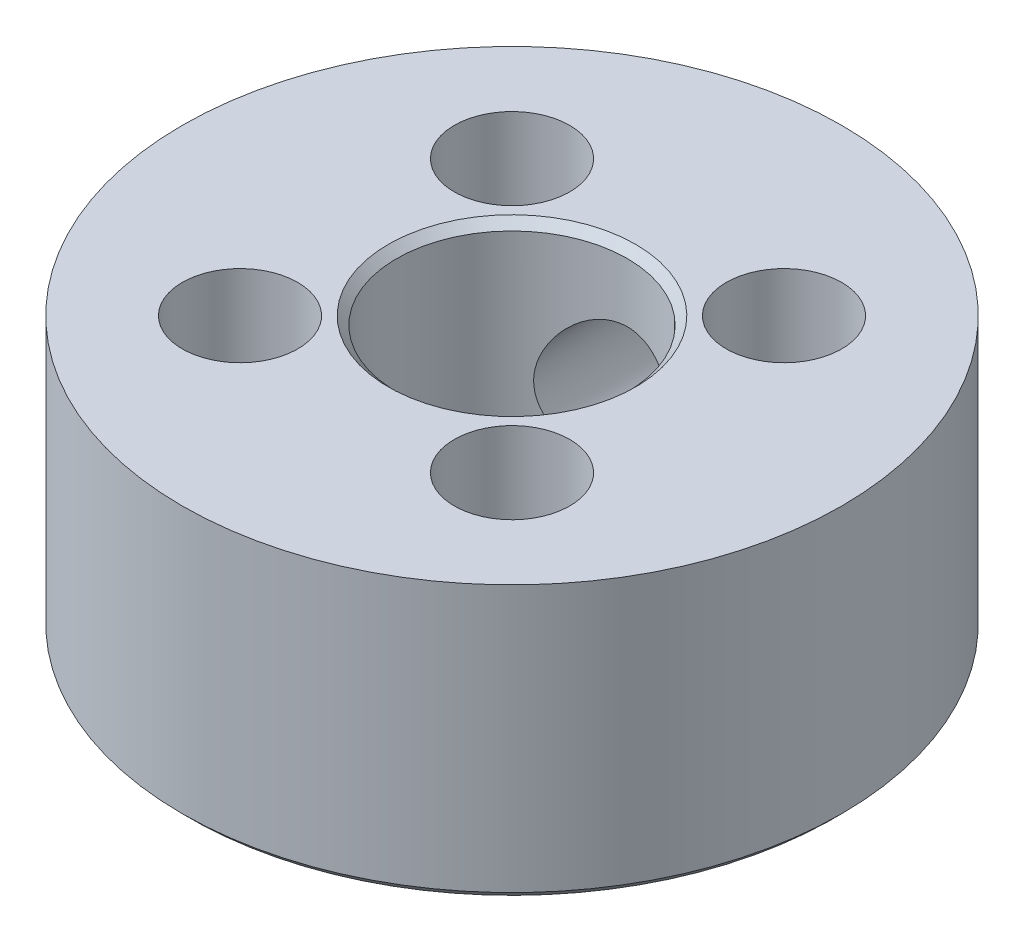
ISO-10303-21;
HEADER;
FILE_DESCRIPTION(('STEP AP214'),'2;1');
FILE_NAME('part.step','',(''),(''),'','','');
FILE_SCHEMA(('AUTOMOTIVE_DESIGN { 1 0 10303 214 1 1 1 1 }'));
ENDSEC;
DATA;
#1=APPLICATION_CONTEXT('core data for automotive mechanical design processes');
#2=APPLICATION_PROTOCOL_DEFINITION('international standard','automotive_design',2000,#1);
#3=PRODUCT_CONTEXT('',#1,'mechanical');
#4=PRODUCT('Part','Part','',(#3));
#5=PRODUCT_RELATED_PRODUCT_CATEGORY('part','',(#4));
#6=PRODUCT_DEFINITION_FORMATION('','',#4);
#7=PRODUCT_DEFINITION_CONTEXT('part definition',#1,'design');
#8=PRODUCT_DEFINITION('design','',#6,#7);
#9=PRODUCT_DEFINITION_SHAPE('','',#8);
#10=(LENGTH_UNIT() NAMED_UNIT(*) SI_UNIT(.MILLI.,.METRE.));
#11=(NAMED_UNIT(*) PLANE_ANGLE_UNIT() SI_UNIT($,.RADIAN.));
#12=(NAMED_UNIT(*) SI_UNIT($,.STERADIAN.) SOLID_ANGLE_UNIT());
#13=UNCERTAINTY_MEASURE_WITH_UNIT(LENGTH_MEASURE(1.E-05),#10,'distance_accuracy_value','');
#14=(GEOMETRIC_REPRESENTATION_CONTEXT(3) GLOBAL_UNCERTAINTY_ASSIGNED_CONTEXT((#13)) GLOBAL_UNIT_ASSIGNED_CONTEXT((#10,
#11,#12)) REPRESENTATION_CONTEXT('',''));
#15=CARTESIAN_POINT('',(0.,0.,0.));
#16=DIRECTION('',(0.,0.,1.));
#17=DIRECTION('',(1.,0.,0.));
#18=AXIS2_PLACEMENT_3D('',#15,#16,#17);
#19=CARTESIAN_POINT('',(-30.4497461438242,18.50200000001,4.94974614382413));
#20=DIRECTION('',(0.,1.,0.));
#21=DIRECTION('',(0.,0.,-1.));
#22=AXIS2_PLACEMENT_3D('',#19,#20,#21);
#23=CYLINDRICAL_SURFACE('',#22,1.25);
#24=CARTESIAN_POINT('',(-30.4497461438242,10.50000000001,4.94974614382413));
#25=DIRECTION('',(0.,-1.,0.));
#26=DIRECTION('',(0.,0.,-1.));
#27=AXIS2_PLACEMENT_3D('',#24,#25,#26);
#28=CIRCLE('',#27,1.25);
#29=CARTESIAN_POINT('',(-30.4497461438242,10.50000000001,3.69974614382413));
#30=VERTEX_POINT('',#29);
#31=EDGE_CURVE('E37',#30,#30,#28,.F.);
#32=ORIENTED_EDGE('',*,*,#31,.T.);
#33=EDGE_LOOP('',(#32));
#34=FACE_BOUND('',#33,.T.);
#35=CARTESIAN_POINT('',(-30.4497461438242,8.80000000000791,4.94974614382413));
#36=DIRECTION('',(0.,1.,0.));
#37=DIRECTION('',(0.,0.,1.));
#38=AXIS2_PLACEMENT_3D('',#35,#36,#37);
#39=CIRCLE('',#38,1.24999999998268);
#40=CARTESIAN_POINT('',(-30.4497461438242,8.80000000000896,3.69974614383279));
#41=VERTEX_POINT('',#40);
#42=EDGE_CURVE('E163',#41,#41,#39,.T.);
#43=ORIENTED_EDGE('',*,*,#42,.F.);
#44=EDGE_LOOP('',(#43));
#45=FACE_BOUND('',#44,.T.);
#46=ADVANCED_FACE('F34',(#34,#45),#23,.F.);
#47=CARTESIAN_POINT('',(-20.5502538561759,18.50200000001,4.94974614382412));
#48=DIRECTION('',(0.,1.,0.));
#49=DIRECTION('',(0.,0.,-1.));
#50=AXIS2_PLACEMENT_3D('',#47,#48,#49);
#51=CYLINDRICAL_SURFACE('',#50,1.25);
#52=CARTESIAN_POINT('',(-20.5502538561759,10.50000000001,4.94974614382412));
#53=DIRECTION('',(0.,-1.,0.));
#54=DIRECTION('',(0.,0.,-1.));
#55=AXIS2_PLACEMENT_3D('',#52,#53,#54);
#56=CIRCLE('',#55,1.25);
#57=CARTESIAN_POINT('',(-20.5502538561759,10.50000000001,3.69974614382412));
#58=VERTEX_POINT('',#57);
#59=EDGE_CURVE('E121',#58,#58,#56,.F.);
#60=ORIENTED_EDGE('',*,*,#59,.T.);
#61=EDGE_LOOP('',(#60));
#62=FACE_BOUND('',#61,.T.);
#63=CARTESIAN_POINT('',(-20.5502538561759,8.80000000000791,4.94974614382412));
#64=DIRECTION('',(0.,1.,0.));
#65=DIRECTION('',(0.,0.,1.));
#66=AXIS2_PLACEMENT_3D('',#63,#64,#65);
#67=CIRCLE('',#66,1.24999999998269);
#68=CARTESIAN_POINT('',(-20.5502538561759,8.80000000000896,3.69974614383278));
#69=VERTEX_POINT('',#68);
#70=EDGE_CURVE('E130',#69,#69,#67,.T.);
#71=ORIENTED_EDGE('',*,*,#70,.F.);
#72=EDGE_LOOP('',(#71));
#73=FACE_BOUND('',#72,.T.);
#74=ADVANCED_FACE('F265',(#62,#73),#51,.F.);
#75=CARTESIAN_POINT('',(-20.5502538561759,18.50200000001,-4.94974614382412));
#76=DIRECTION('',(0.,1.,0.));
#77=DIRECTION('',(0.,0.,-1.));
#78=AXIS2_PLACEMENT_3D('',#75,#76,#77);
#79=CYLINDRICAL_SURFACE('',#78,1.25);
#80=CARTESIAN_POINT('',(-20.5502538561759,10.50000000001,-4.94974614382412));
#81=DIRECTION('',(0.,-1.,0.));
#82=DIRECTION('',(0.,0.,-1.));
#83=AXIS2_PLACEMENT_3D('',#80,#81,#82);
#84=CIRCLE('',#83,1.25);
#85=CARTESIAN_POINT('',(-20.5502538561759,10.50000000001,-6.19974614382412));
#86=VERTEX_POINT('',#85);
#87=EDGE_CURVE('E292',#86,#86,#84,.F.);
#88=ORIENTED_EDGE('',*,*,#87,.T.);
#89=EDGE_LOOP('',(#88));
#90=FACE_BOUND('',#89,.T.);
#91=CARTESIAN_POINT('',(-20.5502538561759,8.80000000006476,-4.94974614382412));
#92=DIRECTION('',(0.,1.,0.));
#93=DIRECTION('',(0.,0.,1.));
#94=AXIS2_PLACEMENT_3D('',#91,#92,#93);
#95=CIRCLE('',#94,1.2499999999582);
#96=CARTESIAN_POINT('',(-20.5502538561759,8.80000000003738,-6.19974614380322));
#97=VERTEX_POINT('',#96);
#98=EDGE_CURVE('E50',#97,#97,#95,.T.);
#99=ORIENTED_EDGE('',*,*,#98,.F.);
#100=EDGE_LOOP('',(#99));
#101=FACE_BOUND('',#100,.T.);
#102=ADVANCED_FACE('F262',(#90,#101),#79,.F.);
#103=CARTESIAN_POINT('',(-30.4497461438242,18.50200000001,-4.94974614382412));
#104=DIRECTION('',(0.,1.,0.));
#105=DIRECTION('',(0.,0.,-1.));
#106=AXIS2_PLACEMENT_3D('',#103,#104,#105);
#107=CYLINDRICAL_SURFACE('',#106,1.25);
#108=CARTESIAN_POINT('',(-30.4497461438242,10.50000000001,-4.94974614382412));
#109=DIRECTION('',(0.,-1.,0.));
#110=DIRECTION('',(0.,0.,-1.));
#111=AXIS2_PLACEMENT_3D('',#108,#109,#110);
#112=CIRCLE('',#111,1.25);
#113=CARTESIAN_POINT('',(-30.4497461438242,10.50000000001,-6.19974614382412));
#114=VERTEX_POINT('',#113);
#115=EDGE_CURVE('E290',#114,#114,#112,.F.);
#116=ORIENTED_EDGE('',*,*,#115,.T.);
#117=EDGE_LOOP('',(#116));
#118=FACE_BOUND('',#117,.T.);
#119=CARTESIAN_POINT('',(-30.4497461438242,8.80000000006476,-4.94974614382412));
#120=DIRECTION('',(0.,1.,0.));
#121=DIRECTION('',(0.,0.,1.));
#122=AXIS2_PLACEMENT_3D('',#119,#120,#121);
#123=CIRCLE('',#122,1.2499999999582);
#124=CARTESIAN_POINT('',(-30.4497461438242,8.80000000003738,-6.19974614380322));
#125=VERTEX_POINT('',#124);
#126=EDGE_CURVE('E167',#125,#125,#123,.T.);
#127=ORIENTED_EDGE('',*,*,#126,.F.);
#128=EDGE_LOOP('',(#127));
#129=FACE_BOUND('',#128,.T.);
#130=ADVANCED_FACE('F259',(#118,#129),#107,.F.);
#131=CARTESIAN_POINT('',(-20.5502538561759,8.49999999996953,-4.94974614382412));
#132=DIRECTION('',(0.,-1.,0.));
#133=DIRECTION('',(0.,0.,1.));
#134=AXIS2_PLACEMENT_3D('',#131,#132,#133);
#135=CONICAL_SURFACE('',#134,1.54999999999658,0.785398163302709);
#136=ORIENTED_EDGE('',*,*,#98,.T.);
#137=EDGE_LOOP('',(#136));
#138=FACE_BOUND('',#137,.T.);
#139=CARTESIAN_POINT('',(-20.5502538561759,8.49999999996953,-4.94974614382412));
#140=DIRECTION('',(0.,1.,0.));
#141=DIRECTION('',(0.,0.,1.));
#142=AXIS2_PLACEMENT_3D('',#139,#140,#141);
#143=CIRCLE('',#142,1.54999999999658);
#144=CARTESIAN_POINT('',(-20.5502538561759,8.49999999996953,-6.4997461438207));
#145=VERTEX_POINT('',#144);
#146=EDGE_CURVE('E285',#145,#145,#143,.T.);
#147=ORIENTED_EDGE('',*,*,#146,.F.);
#148=EDGE_LOOP('',(#147));
#149=FACE_BOUND('',#148,.T.);
#150=ADVANCED_FACE('F255',(#138,#149),#135,.F.);
#151=CARTESIAN_POINT('',(-30.4497461438242,8.49999999996953,-4.94974614382412));
#152=DIRECTION('',(0.,-1.,0.));
#153=DIRECTION('',(0.,0.,1.));
#154=AXIS2_PLACEMENT_3D('',#151,#152,#153);
#155=CONICAL_SURFACE('',#154,1.54999999999658,0.785398163302709);
#156=ORIENTED_EDGE('',*,*,#126,.T.);
#157=EDGE_LOOP('',(#156));
#158=FACE_BOUND('',#157,.T.);
#159=CARTESIAN_POINT('',(-30.4497461438242,8.49999999996953,-4.94974614382412));
#160=DIRECTION('',(0.,1.,0.));
#161=DIRECTION('',(0.,0.,1.));
#162=AXIS2_PLACEMENT_3D('',#159,#160,#161);
#163=CIRCLE('',#162,1.54999999999658);
#164=CARTESIAN_POINT('',(-30.4497461438242,8.49999999996953,-6.4997461438207));
#165=VERTEX_POINT('',#164);
#166=EDGE_CURVE('E281',#165,#165,#163,.T.);
#167=ORIENTED_EDGE('',*,*,#166,.F.);
#168=EDGE_LOOP('',(#167));
#169=FACE_BOUND('',#168,.T.);
#170=ADVANCED_FACE('F251',(#158,#169),#155,.F.);
#171=CARTESIAN_POINT('',(-30.4497461438242,8.50000000002638,4.94974614382413));
#172=DIRECTION('',(0.,-1.,0.));
#173=DIRECTION('',(0.,0.,1.));
#174=AXIS2_PLACEMENT_3D('',#171,#172,#173);
#175=CONICAL_SURFACE('',#174,1.54999999996421,0.785398163397448);
#176=ORIENTED_EDGE('',*,*,#42,.T.);
#177=EDGE_LOOP('',(#176));
#178=FACE_BOUND('',#177,.T.);
#179=CARTESIAN_POINT('',(-30.4497461438242,8.50000000002638,4.94974614382413));
#180=DIRECTION('',(0.,1.,0.));
#181=DIRECTION('',(0.,0.,1.));
#182=AXIS2_PLACEMENT_3D('',#179,#180,#181);
#183=CIRCLE('',#182,1.54999999996421);
#184=CARTESIAN_POINT('',(-30.4497461438242,8.50000000002638,3.39974614385992));
#185=VERTEX_POINT('',#184);
#186=EDGE_CURVE('E278',#185,#185,#183,.T.);
#187=ORIENTED_EDGE('',*,*,#186,.F.);
#188=EDGE_LOOP('',(#187));
#189=FACE_BOUND('',#188,.T.);
#190=ADVANCED_FACE('F248',(#178,#189),#175,.F.);
#191=CARTESIAN_POINT('',(-20.5502538561759,8.50000000002638,4.94974614382412));
#192=DIRECTION('',(0.,-1.,0.));
#193=DIRECTION('',(0.,0.,1.));
#194=AXIS2_PLACEMENT_3D('',#191,#192,#193);
#195=CONICAL_SURFACE('',#194,1.54999999996422,0.785398163397448);
#196=ORIENTED_EDGE('',*,*,#70,.T.);
#197=EDGE_LOOP('',(#196));
#198=FACE_BOUND('',#197,.T.);
#199=CARTESIAN_POINT('',(-20.5502538561759,8.50000000002638,4.94974614382412));
#200=DIRECTION('',(0.,1.,0.));
#201=DIRECTION('',(0.,0.,1.));
#202=AXIS2_PLACEMENT_3D('',#199,#200,#201);
#203=CIRCLE('',#202,1.54999999996422);
#204=CARTESIAN_POINT('',(-20.5502538561759,8.50000000002638,3.3997461438599));
#205=VERTEX_POINT('',#204);
#206=EDGE_CURVE('E280',#205,#205,#203,.T.);
#207=ORIENTED_EDGE('',*,*,#206,.F.);
#208=EDGE_LOOP('',(#207));
#209=FACE_BOUND('',#208,.T.);
#210=ADVANCED_FACE('F244',(#198,#209),#195,.F.);
#211=CARTESIAN_POINT('',(-35.50000000002,10.50000000001,0.));
#212=DIRECTION('',(0.,1.,0.));
#213=DIRECTION('',(0.,0.,-1.));
#214=AXIS2_PLACEMENT_3D('',#211,#212,#213);
#215=PLANE('',#214);
#216=ORIENTED_EDGE('',*,*,#31,.F.);
#217=EDGE_LOOP('',(#216));
#218=FACE_BOUND('',#217,.T.);
#219=CARTESIAN_POINT('',(-30.4497461438242,10.50000000001,4.94974614382413));
#220=DIRECTION('',(0.,-1.,0.));
#221=DIRECTION('',(0.,0.,-1.));
#222=AXIS2_PLACEMENT_3D('',#219,#220,#221);
#223=CIRCLE('',#222,2.1);
#224=CARTESIAN_POINT('',(-30.4497461438242,10.50000000001,2.84974614382413));
#225=VERTEX_POINT('',#224);
#226=EDGE_CURVE('E302',#225,#225,#223,.T.);
#227=ORIENTED_EDGE('',*,*,#226,.F.);
#228=EDGE_LOOP('',(#227));
#229=FACE_BOUND('',#228,.T.);
#230=ADVANCED_FACE('F240',(#218,#229),#215,.T.);
#231=CARTESIAN_POINT('',(-35.50000000002,10.50000000001,0.));
#232=DIRECTION('',(0.,1.,0.));
#233=DIRECTION('',(0.,0.,-1.));
#234=AXIS2_PLACEMENT_3D('',#231,#232,#233);
#235=PLANE('',#234);
#236=ORIENTED_EDGE('',*,*,#59,.F.);
#237=EDGE_LOOP('',(#236));
#238=FACE_BOUND('',#237,.T.);
#239=CARTESIAN_POINT('',(-20.5502538561759,10.50000000001,4.94974614382412));
#240=DIRECTION('',(0.,-1.,0.));
#241=DIRECTION('',(0.,0.,-1.));
#242=AXIS2_PLACEMENT_3D('',#239,#240,#241);
#243=CIRCLE('',#242,2.1);
#244=CARTESIAN_POINT('',(-20.5502538561759,10.50000000001,2.84974614382412));
#245=VERTEX_POINT('',#244);
#246=EDGE_CURVE('E299',#245,#245,#243,.T.);
#247=ORIENTED_EDGE('',*,*,#246,.F.);
#248=EDGE_LOOP('',(#247));
#249=FACE_BOUND('',#248,.T.);
#250=ADVANCED_FACE('F236',(#238,#249),#235,.T.);
#251=CARTESIAN_POINT('',(-35.50000000002,10.50000000001,0.));
#252=DIRECTION('',(0.,1.,0.));
#253=DIRECTION('',(0.,0.,-1.));
#254=AXIS2_PLACEMENT_3D('',#251,#252,#253);
#255=PLANE('',#254);
#256=ORIENTED_EDGE('',*,*,#87,.F.);
#257=EDGE_LOOP('',(#256));
#258=FACE_BOUND('',#257,.T.);
#259=CARTESIAN_POINT('',(-20.5502538561759,10.50000000001,-4.94974614382412));
#260=DIRECTION('',(0.,-1.,0.));
#261=DIRECTION('',(0.,0.,-1.));
#262=AXIS2_PLACEMENT_3D('',#259,#260,#261);
#263=CIRCLE('',#262,2.1);
#264=CARTESIAN_POINT('',(-20.5502538561759,10.50000000001,-7.04974614382412));
#265=VERTEX_POINT('',#264);
#266=EDGE_CURVE('E297',#265,#265,#263,.T.);
#267=ORIENTED_EDGE('',*,*,#266,.F.);
#268=EDGE_LOOP('',(#267));
#269=FACE_BOUND('',#268,.T.);
#270=ADVANCED_FACE('F232',(#258,#269),#255,.T.);
#271=CARTESIAN_POINT('',(-35.50000000002,10.50000000001,0.));
#272=DIRECTION('',(0.,1.,0.));
#273=DIRECTION('',(0.,0.,-1.));
#274=AXIS2_PLACEMENT_3D('',#271,#272,#273);
#275=PLANE('',#274);
#276=ORIENTED_EDGE('',*,*,#115,.F.);
#277=EDGE_LOOP('',(#276));
#278=FACE_BOUND('',#277,.T.);
#279=CARTESIAN_POINT('',(-30.4497461438242,10.50000000001,-4.94974614382412));
#280=DIRECTION('',(0.,-1.,0.));
#281=DIRECTION('',(0.,0.,-1.));
#282=AXIS2_PLACEMENT_3D('',#279,#280,#281);
#283=CIRCLE('',#282,2.1);
#284=CARTESIAN_POINT('',(-30.4497461438242,10.50000000001,-7.04974614382412));
#285=VERTEX_POINT('',#284);
#286=EDGE_CURVE('E159',#285,#285,#283,.T.);
#287=ORIENTED_EDGE('',*,*,#286,.F.);
#288=EDGE_LOOP('',(#287));
#289=FACE_BOUND('',#288,.T.);
#290=ADVANCED_FACE('F228',(#278,#289),#275,.T.);
#291=CARTESIAN_POINT('',(-25.5,8.50000000002638,0.));
#292=DIRECTION('',(0.,-1.,0.));
#293=DIRECTION('',(0.,0.,1.));
#294=AXIS2_PLACEMENT_3D('',#291,#292,#293);
#295=CONICAL_SURFACE('',#294,4.49999999995043,0.785398163302709);
#296=CARTESIAN_POINT('',(-25.5,8.80000000001,0.));
#297=DIRECTION('',(0.,-1.,0.));
#298=DIRECTION('',(0.,0.,-1.));
#299=AXIS2_PLACEMENT_3D('',#296,#297,#298);
#300=CIRCLE('',#299,4.2);
#301=CARTESIAN_POINT('',(-25.5,8.80000000000896,-4.20000000001287));
#302=VERTEX_POINT('',#301);
#303=EDGE_CURVE('E152',#302,#302,#300,.T.);
#304=ORIENTED_EDGE('',*,*,#303,.F.);
#305=EDGE_LOOP('',(#304));
#306=FACE_BOUND('',#305,.T.);
#307=CARTESIAN_POINT('',(-25.5,8.50000000002638,0.));
#308=DIRECTION('',(0.,1.,0.));
#309=DIRECTION('',(0.,0.,1.));
#310=AXIS2_PLACEMENT_3D('',#307,#308,#309);
#311=CIRCLE('',#310,4.49999999995043);
#312=CARTESIAN_POINT('',(-25.5,8.50000000002638,-4.49999999995043));
#313=VERTEX_POINT('',#312);
#314=EDGE_CURVE('E283',#313,#313,#311,.T.);
#315=ORIENTED_EDGE('',*,*,#314,.F.);
#316=EDGE_LOOP('',(#315));
#317=FACE_BOUND('',#316,.T.);
#318=ADVANCED_FACE('F224',(#306,#317),#295,.F.);
#319=CARTESIAN_POINT('',(-35.50000000002,8.50000000001,0.));
#320=DIRECTION('',(0.,1.,0.));
#321=DIRECTION('',(0.,0.,-1.));
#322=AXIS2_PLACEMENT_3D('',#319,#320,#321);
#323=PLANE('',#322);
#324=CARTESIAN_POINT('',(-25.5,8.50000000001077,0.));
#325=DIRECTION('',(0.,-1.,0.));
#326=DIRECTION('',(0.,0.,-1.));
#327=AXIS2_PLACEMENT_3D('',#324,#325,#326);
#328=CIRCLE('',#327,11.6999999999992);
#329=CARTESIAN_POINT('',(-25.5,8.50000000001077,-11.6999999999992));
#330=VERTEX_POINT('',#329);
#331=EDGE_CURVE('E154',#330,#330,#328,.T.);
#332=ORIENTED_EDGE('',*,*,#331,.T.);
#333=EDGE_LOOP('',(#332));
#334=FACE_BOUND('',#333,.T.);
#335=ORIENTED_EDGE('',*,*,#314,.T.);
#336=EDGE_LOOP('',(#335));
#337=FACE_BOUND('',#336,.T.);
#338=ORIENTED_EDGE('',*,*,#206,.T.);
#339=EDGE_LOOP('',(#338));
#340=FACE_BOUND('',#339,.T.);
#341=ORIENTED_EDGE('',*,*,#186,.T.);
#342=EDGE_LOOP('',(#341));
#343=FACE_BOUND('',#342,.T.);
#344=ORIENTED_EDGE('',*,*,#166,.T.);
#345=EDGE_LOOP('',(#344));
#346=FACE_BOUND('',#345,.T.);
#347=ORIENTED_EDGE('',*,*,#146,.T.);
#348=EDGE_LOOP('',(#347));
#349=FACE_BOUND('',#348,.T.);
#350=ADVANCED_FACE('F220',(#334,#337,#340,#343,#346,#349),#323,.F.);
#351=CARTESIAN_POINT('',(-25.5,18.4999999999036,0.));
#352=DIRECTION('',(0.,1.,0.));
#353=DIRECTION('',(0.,0.,-1.));
#354=AXIS2_PLACEMENT_3D('',#351,#352,#353);
#355=CONICAL_SURFACE('',#354,4.49999999989359,0.785398163397448);
#356=CARTESIAN_POINT('',(-25.5,18.4999999999604,0.));
#357=DIRECTION('',(0.,-1.,0.));
#358=DIRECTION('',(0.,0.,-1.));
#359=AXIS2_PLACEMENT_3D('',#356,#357,#358);
#360=CIRCLE('',#359,4.49999999995043);
#361=CARTESIAN_POINT('',(-25.5,18.4999999999604,-4.49999999995043));
#362=VERTEX_POINT('',#361);
#363=EDGE_CURVE('E322',#362,#362,#360,.F.);
#364=ORIENTED_EDGE('',*,*,#363,.T.);
#365=EDGE_LOOP('',(#364));
#366=FACE_BOUND('',#365,.T.);
#367=CARTESIAN_POINT('',(-25.5,18.20000000001,0.));
#368=DIRECTION('',(0.,-1.,0.));
#369=DIRECTION('',(0.,0.,-1.));
#370=AXIS2_PLACEMENT_3D('',#367,#368,#369);
#371=CIRCLE('',#370,4.2);
#372=CARTESIAN_POINT('',(-25.5,18.2000000000229,-4.19999999998445));
#373=VERTEX_POINT('',#372);
#374=EDGE_CURVE('E155',#373,#373,#371,.F.);
#375=ORIENTED_EDGE('',*,*,#374,.F.);
#376=EDGE_LOOP('',(#375));
#377=FACE_BOUND('',#376,.T.);
#378=ADVANCED_FACE('F216',(#366,#377),#355,.F.);
#379=CARTESIAN_POINT('',(-30.4497461438242,18.50200000001,4.94974614382413));
#380=DIRECTION('',(0.,1.,0.));
#381=DIRECTION('',(0.,0.,-1.));
#382=AXIS2_PLACEMENT_3D('',#379,#380,#381);
#383=CYLINDRICAL_SURFACE('',#382,2.1);
#384=CARTESIAN_POINT('',(-30.4497461438242,18.50000000001,4.94974614382413));
#385=DIRECTION('',(0.,-1.,0.));
#386=DIRECTION('',(0.,0.,-1.));
#387=AXIS2_PLACEMENT_3D('',#384,#385,#386);
#388=CIRCLE('',#387,2.1);
#389=CARTESIAN_POINT('',(-30.4497461438242,18.50000000001,2.84974614382413));
#390=VERTEX_POINT('',#389);
#391=EDGE_CURVE('E324',#390,#390,#388,.F.);
#392=ORIENTED_EDGE('',*,*,#391,.T.);
#393=EDGE_LOOP('',(#392));
#394=FACE_BOUND('',#393,.T.);
#395=ORIENTED_EDGE('',*,*,#226,.T.);
#396=EDGE_LOOP('',(#395));
#397=FACE_BOUND('',#396,.T.);
#398=ADVANCED_FACE('F212',(#394,#397),#383,.F.);
#399=CARTESIAN_POINT('',(-20.5502538561759,18.50200000001,4.94974614382412));
#400=DIRECTION('',(0.,1.,0.));
#401=DIRECTION('',(0.,0.,-1.));
#402=AXIS2_PLACEMENT_3D('',#399,#400,#401);
#403=CYLINDRICAL_SURFACE('',#402,2.1);
#404=CARTESIAN_POINT('',(-20.5502538561759,18.50000000001,4.94974614382412));
#405=DIRECTION('',(0.,-1.,0.));
#406=DIRECTION('',(0.,0.,-1.));
#407=AXIS2_PLACEMENT_3D('',#404,#405,#406);
#408=CIRCLE('',#407,2.1);
#409=CARTESIAN_POINT('',(-20.5502538561759,18.50000000001,2.84974614382412));
#410=VERTEX_POINT('',#409);
#411=EDGE_CURVE('E326',#410,#410,#408,.F.);
#412=ORIENTED_EDGE('',*,*,#411,.T.);
#413=EDGE_LOOP('',(#412));
#414=FACE_BOUND('',#413,.T.);
#415=ORIENTED_EDGE('',*,*,#246,.T.);
#416=EDGE_LOOP('',(#415));
#417=FACE_BOUND('',#416,.T.);
#418=ADVANCED_FACE('F208',(#414,#417),#403,.F.);
#419=CARTESIAN_POINT('',(-20.5502538561759,18.50200000001,-4.94974614382412));
#420=DIRECTION('',(0.,1.,0.));
#421=DIRECTION('',(0.,0.,-1.));
#422=AXIS2_PLACEMENT_3D('',#419,#420,#421);
#423=CYLINDRICAL_SURFACE('',#422,2.1);
#424=CARTESIAN_POINT('',(-20.5502538561759,18.50000000001,-4.94974614382412));
#425=DIRECTION('',(0.,-1.,0.));
#426=DIRECTION('',(0.,0.,-1.));
#427=AXIS2_PLACEMENT_3D('',#424,#425,#426);
#428=CIRCLE('',#427,2.1);
#429=CARTESIAN_POINT('',(-20.5502538561759,18.50000000001,-7.04974614382412));
#430=VERTEX_POINT('',#429);
#431=EDGE_CURVE('E327',#430,#430,#428,.F.);
#432=ORIENTED_EDGE('',*,*,#431,.T.);
#433=EDGE_LOOP('',(#432));
#434=FACE_BOUND('',#433,.T.);
#435=ORIENTED_EDGE('',*,*,#266,.T.);
#436=EDGE_LOOP('',(#435));
#437=FACE_BOUND('',#436,.T.);
#438=ADVANCED_FACE('F204',(#434,#437),#423,.F.);
#439=CARTESIAN_POINT('',(-30.4497461438242,18.50200000001,-4.94974614382412));
#440=DIRECTION('',(0.,1.,0.));
#441=DIRECTION('',(0.,0.,-1.));
#442=AXIS2_PLACEMENT_3D('',#439,#440,#441);
#443=CYLINDRICAL_SURFACE('',#442,2.1);
#444=CARTESIAN_POINT('',(-30.4497461438242,18.50000000001,-4.94974614382412));
#445=DIRECTION('',(0.,-1.,0.));
#446=DIRECTION('',(0.,0.,-1.));
#447=AXIS2_PLACEMENT_3D('',#444,#445,#446);
#448=CIRCLE('',#447,2.1);
#449=CARTESIAN_POINT('',(-30.4497461438242,18.50000000001,-7.04974614382412));
#450=VERTEX_POINT('',#449);
#451=EDGE_CURVE('E147',#450,#450,#448,.F.);
#452=ORIENTED_EDGE('',*,*,#451,.T.);
#453=EDGE_LOOP('',(#452));
#454=FACE_BOUND('',#453,.T.);
#455=ORIENTED_EDGE('',*,*,#286,.T.);
#456=EDGE_LOOP('',(#455));
#457=FACE_BOUND('',#456,.T.);
#458=ADVANCED_FACE('F200',(#454,#457),#443,.F.);
#459=CARTESIAN_POINT('',(-25.5,18.50200000001,0.));
#460=DIRECTION('',(0.,1.,0.));
#461=DIRECTION('',(0.,0.,-1.));
#462=AXIS2_PLACEMENT_3D('',#459,#460,#461);
#463=CYLINDRICAL_SURFACE('',#462,4.2);
#464=CARTESIAN_POINT('',(-28.0466918310846,13.3701511743004,-3.33981447351304));
#465=CARTESIAN_POINT('',(-28.0399996927325,13.2388615684585,-3.34491603063782));
#466=CARTESIAN_POINT('',(-28.023102492779,13.1084142548455,-3.35783801589314));
#467=CARTESIAN_POINT('',(-27.9701303416004,12.8534980770102,-3.39698439092769));
#468=CARTESIAN_POINT('',(-27.9340270450937,12.7290383463658,-3.42322843942132));
#469=CARTESIAN_POINT('',(-27.8449347452476,12.4900840818974,-3.48484833870774));
#470=CARTESIAN_POINT('',(-27.7920841493058,12.3755173307071,-3.52014890239554));
#471=CARTESIAN_POINT('',(-27.6711214840442,12.1567315719691,-3.59601547695757));
#472=CARTESIAN_POINT('',(-27.6030070928127,12.0525141422333,-3.63658228853226));
#473=CARTESIAN_POINT('',(-27.4425014345844,11.8419831940034,-3.72507480071735));
#474=CARTESIAN_POINT('',(-27.3480649178397,11.7373280620777,-3.77324875811566));
#475=CARTESIAN_POINT('',(-27.1425461857975,11.5443881769187,-3.86714613784206));
#476=CARTESIAN_POINT('',(-27.031453306492,11.456113992977,-3.91286796457863));
#477=CARTESIAN_POINT('',(-26.786672101706,11.2932096934457,-4.00030022973895));
#478=CARTESIAN_POINT('',(-26.6519938706441,11.2198109033266,-4.04156803311493));
#479=CARTESIAN_POINT('',(-26.3689270226317,11.0976813339225,-4.11170609338944));
#480=CARTESIAN_POINT('',(-26.2205565186165,11.0489185026417,-4.14059245139574));
#481=CARTESIAN_POINT('',(-25.934072656692,10.9834663732055,-4.17969510752418));
#482=CARTESIAN_POINT('',(-25.7969484958791,10.9635650830715,-4.19177349690257));
#483=CARTESIAN_POINT('',(-25.5207983243213,10.9463428741486,-4.20221465044528));
#484=CARTESIAN_POINT('',(-25.3817735878406,10.9490075021478,-4.20058619369144));
#485=CARTESIAN_POINT('',(-25.1214938622602,10.9752203028051,-4.18472587081963));
#486=CARTESIAN_POINT('',(-24.9999183155986,10.9965231338,-4.17184931761434));
#487=CARTESIAN_POINT('',(-24.7624332205967,11.055929364554,-4.13647339406768));
#488=CARTESIAN_POINT('',(-24.646524431958,11.0940350101223,-4.11397273741222));
#489=CARTESIAN_POINT('',(-24.4187618021801,11.1871830505372,-4.06018784499785));
#490=CARTESIAN_POINT('',(-24.3072116148504,11.2427942584789,-4.02861228490887));
#491=CARTESIAN_POINT('',(-24.0947152493664,11.3685822676862,-3.95950488985953));
#492=CARTESIAN_POINT('',(-23.9937728852432,11.4387642810644,-3.92197092465622));
#493=CARTESIAN_POINT('',(-23.7910623118112,11.602324408979,-3.83837056587799));
#494=CARTESIAN_POINT('',(-23.6909737377163,11.6975468324155,-3.79183351606557));
#495=CARTESIAN_POINT('',(-23.5073047618537,11.902907053756,-3.69862132286565));
#496=CARTESIAN_POINT('',(-23.4237493027998,12.0130669715259,-3.65194607704245));
#497=CARTESIAN_POINT('',(-23.2676810987158,12.2581253760449,-3.55889957098511));
#498=CARTESIAN_POINT('',(-23.1969770094894,12.3943806079902,-3.51298031173102));
#499=CARTESIAN_POINT('',(-23.1095990181085,12.608690241505,-3.45358239535067));
#500=CARTESIAN_POINT('',(-23.0835956812504,12.6817362041902,-3.43537103810313));
#501=CARTESIAN_POINT('',(-23.0381736814787,12.8306933434966,-3.40296690753615));
#502=CARTESIAN_POINT('',(-23.0187518970867,12.9066031428278,-3.38877222972678));
#503=CARTESIAN_POINT('',(-22.9796095752904,13.0959560555893,-3.35983615782329));
#504=CARTESIAN_POINT('',(-22.9638189101986,13.2106796134023,-3.34781670899586));
#505=CARTESIAN_POINT('',(-22.9480383833465,13.4417519675926,-3.33580534703037));
#506=CARTESIAN_POINT('',(-22.9480363897793,13.558099447423,-3.33580419918806));
#507=CARTESIAN_POINT('',(-22.9637857461499,13.7889539015179,-3.34779109397998));
#508=CARTESIAN_POINT('',(-22.979521825557,13.9034625505548,-3.35976751487126));
#509=CARTESIAN_POINT('',(-23.0258419165542,14.1278515121857,-3.39401724771358));
#510=CARTESIAN_POINT('',(-23.0564386518415,14.2377277707515,-3.41629938263758));
#511=CARTESIAN_POINT('',(-23.1330682612357,14.4561404573398,-3.46985775186049));
#512=CARTESIAN_POINT('',(-23.179801509649,14.5643301405187,-3.50153075059326));
#513=CARTESIAN_POINT('',(-23.2867984916489,14.7719670302082,-3.57012283745897));
#514=CARTESIAN_POINT('',(-23.3470686611479,14.8714100468578,-3.60704441787093));
#515=CARTESIAN_POINT('',(-23.4933234502079,15.079554850888,-3.69075598762224));
#516=CARTESIAN_POINT('',(-23.5820393368424,15.1861458677781,-3.73804523028403));
#517=CARTESIAN_POINT('',(-23.7759343037413,15.3839583349195,-3.83134338591176));
#518=CARTESIAN_POINT('',(-23.8811277705013,15.4751662083301,-3.87735113827688));
#519=CARTESIAN_POINT('',(-24.1163363363779,15.6473235663662,-3.96770364213218));
#520=CARTESIAN_POINT('',(-24.2477141346232,15.7266925139474,-4.01155632905706));
#521=CARTESIAN_POINT('',(-24.5252818793277,15.8613847970785,-4.08785435492861));
#522=CARTESIAN_POINT('',(-24.6714542852996,15.9167362053673,-4.12031300319466));
#523=CARTESIAN_POINT('',(-24.9573469111796,15.995504436287,-4.16703232431877));
#524=CARTESIAN_POINT('',(-25.0960193251762,16.0217557177197,-4.18289721518859));
#525=CARTESIAN_POINT('',(-25.3766466706175,16.0509081703482,-4.20053400025264));
#526=CARTESIAN_POINT('',(-25.5185988225987,16.05382843483,-4.20231741821642));
#527=CARTESIAN_POINT('',(-25.783614641641,16.0372362004145,-4.19226023393419));
#528=CARTESIAN_POINT('',(-25.90691666158,16.0203506673599,-4.18201491911878));
#529=CARTESIAN_POINT('',(-26.1485463204956,15.9692382830577,-4.15141162067632));
#530=CARTESIAN_POINT('',(-26.2668734472655,15.9350096509049,-4.13105259851054));
#531=CARTESIAN_POINT('',(-26.4979482129417,15.8499052074223,-4.08146284359483));
#532=CARTESIAN_POINT('',(-26.6105505859179,15.7987307522599,-4.05207369284694));
#533=CARTESIAN_POINT('',(-26.8257738217153,15.6817071047785,-3.98685181949657));
#534=CARTESIAN_POINT('',(-26.9283917469807,15.6158536123354,-3.95101720933574));
#535=CARTESIAN_POINT('',(-27.1346397336788,15.461900034566,-3.87062012756685));
#536=CARTESIAN_POINT('',(-27.2367471136759,15.3720376447401,-3.8255271365475));
#537=CARTESIAN_POINT('',(-27.4253375874195,15.1774884806053,-3.73417759996632));
#538=CARTESIAN_POINT('',(-27.5117982976331,15.0727808449647,-3.68791949365795));
#539=CARTESIAN_POINT('',(-27.6762227808311,14.8376670368555,-3.59360331667079));
#540=CARTESIAN_POINT('',(-27.7521880539402,14.7056993250083,-3.54591235770874));
#541=CARTESIAN_POINT('',(-27.8802338429126,14.4275300905856,-3.46127446557713));
#542=CARTESIAN_POINT('',(-27.9323601721339,14.2813565300438,-3.42430697464602));
#543=CARTESIAN_POINT('',(-28.002172976589,14.0075463939624,-3.37352038649179));
#544=CARTESIAN_POINT('',(-28.0245288872612,13.8816840154316,-3.35663288034242));
#545=CARTESIAN_POINT('',(-28.0500396049437,13.6269953661973,-3.33730128096145));
#546=CARTESIAN_POINT('',(-28.0532173943136,13.4981728288401,-3.33483990009075));
#547=CARTESIAN_POINT('',(-28.0466918310846,13.3701511743004,-3.33981447351304));
#548=B_SPLINE_CURVE_WITH_KNOTS('',3,(#464,#465,#466,#467,#468,#469,#470,#471,#472,#473,#474,
#475,#476,#477,#478,#479,#480,#481,#482,#483,#484,#485,#486,#487,#488,#489,#490,#491,#492,#493,
#494,#495,#496,#497,#498,#499,#500,#501,#502,#503,#504,#505,#506,#507,#508,#509,#510,#511,#512,
#513,#514,#515,#516,#517,#518,#519,#520,#521,#522,#523,#524,#525,#526,#527,#528,#529,#530,#531,
#532,#533,#534,#535,#536,#537,#538,#539,#540,#541,#542,#543,#544,#545,#546,#547),.UNSPECIFIED.,
.T.,.F.,(4,2,2,2,2,2,2,2,2,2,2,2,2,2,2,2,2,2,2,2,2,2,2,2,2,2,2,2,2,2,2,2,2,2,2,2,2,2,2,2,2,4),
(0.,0.394103304784507,0.788789866416294,1.18029608586018,1.57186190127716,2.01691651130305,
2.46225728789939,2.93603796169292,3.40920063737703,3.82405394426071,4.23864156246401,
4.60924914091157,4.97990626857612,5.36412873632146,5.74848888155151,6.18402653807501,
6.62021634166916,7.097933404556,7.33651651721747,7.57498631652583,7.92257585062681,
8.2698983014858,8.61688407468264,8.96416746230264,9.32895712421481,9.69392058803843,
10.1316947227464,10.5698532285456,11.0460930240056,11.5217746604055,11.9453379667056,
12.3685546081087,12.7414314258293,13.1143465407911,13.4942184497635,13.8742017862164,
14.3023837890503,14.7311735724045,15.2074048911817,15.6827171089567,16.0674718909409,
16.4517655051574),.UNSPECIFIED.);
#549=CARTESIAN_POINT('',(-28.0466918285131,13.3701511238667,-3.33981447547386));
#550=VERTEX_POINT('',#549);
#551=EDGE_CURVE('E144',#550,#550,#548,.T.);
#552=ORIENTED_EDGE('',*,*,#551,.F.);
#553=EDGE_LOOP('',(#552));
#554=FACE_BOUND('',#553,.T.);
#555=ORIENTED_EDGE('',*,*,#303,.T.);
#556=EDGE_LOOP('',(#555));
#557=FACE_BOUND('',#556,.T.);
#558=ORIENTED_EDGE('',*,*,#374,.T.);
#559=EDGE_LOOP('',(#558));
#560=FACE_BOUND('',#559,.T.);
#561=ADVANCED_FACE('F196',(#554,#557,#560),#463,.F.);
#562=CARTESIAN_POINT('',(-25.5,8.80000000001,0.));
#563=DIRECTION('',(0.,1.,0.));
#564=DIRECTION('',(0.,0.,-1.));
#565=AXIS2_PLACEMENT_3D('',#562,#563,#564);
#566=CONICAL_SURFACE('',#565,12.,0.785398163400007);
#567=CARTESIAN_POINT('',(-25.5,8.80000000001,0.));
#568=DIRECTION('',(0.,-1.,0.));
#569=DIRECTION('',(0.,0.,-1.));
#570=AXIS2_PLACEMENT_3D('',#567,#568,#569);
#571=CIRCLE('',#570,12.);
#572=CARTESIAN_POINT('',(-25.5,8.80000000001,-12.));
#573=VERTEX_POINT('',#572);
#574=EDGE_CURVE('E140',#573,#573,#571,.T.);
#575=ORIENTED_EDGE('',*,*,#574,.T.);
#576=EDGE_LOOP('',(#575));
#577=FACE_BOUND('',#576,.T.);
#578=ORIENTED_EDGE('',*,*,#331,.F.);
#579=EDGE_LOOP('',(#578));
#580=FACE_BOUND('',#579,.T.);
#581=ADVANCED_FACE('F141',(#577,#580),#566,.T.);
#582=CARTESIAN_POINT('',(-35.50000000002,18.50000000001,0.));
#583=DIRECTION('',(0.,1.,0.));
#584=DIRECTION('',(0.,0.,-1.));
#585=AXIS2_PLACEMENT_3D('',#582,#583,#584);
#586=PLANE('',#585);
#587=CARTESIAN_POINT('',(-25.5,18.50000000001,0.));
#588=DIRECTION('',(0.,-1.,0.));
#589=DIRECTION('',(0.,0.,-1.));
#590=AXIS2_PLACEMENT_3D('',#587,#588,#589);
#591=CIRCLE('',#590,12.);
#592=CARTESIAN_POINT('',(-25.5,18.50000000001,-12.));
#593=VERTEX_POINT('',#592);
#594=EDGE_CURVE('E43',#593,#593,#591,.F.);
#595=ORIENTED_EDGE('',*,*,#594,.T.);
#596=EDGE_LOOP('',(#595));
#597=FACE_BOUND('',#596,.T.);
#598=ORIENTED_EDGE('',*,*,#451,.F.);
#599=EDGE_LOOP('',(#598));
#600=FACE_BOUND('',#599,.T.);
#601=ORIENTED_EDGE('',*,*,#431,.F.);
#602=EDGE_LOOP('',(#601));
#603=FACE_BOUND('',#602,.T.);
#604=ORIENTED_EDGE('',*,*,#411,.F.);
#605=EDGE_LOOP('',(#604));
#606=FACE_BOUND('',#605,.T.);
#607=ORIENTED_EDGE('',*,*,#391,.F.);
#608=EDGE_LOOP('',(#607));
#609=FACE_BOUND('',#608,.T.);
#610=ORIENTED_EDGE('',*,*,#363,.F.);
#611=EDGE_LOOP('',(#610));
#612=FACE_BOUND('',#611,.T.);
#613=ADVANCED_FACE('F186',(#597,#600,#603,#606,#609,#612),#586,.T.);
#614=CARTESIAN_POINT('',(-25.50000000001,13.50000000001,-25.));
#615=DIRECTION('',(0.,0.,-1.));
#616=DIRECTION('',(1.,0.,0.));
#617=AXIS2_PLACEMENT_3D('',#614,#615,#616);
#618=CYLINDRICAL_SURFACE('',#617,2.55);
#619=CARTESIAN_POINT('',(-28.0468739381714,13.6262265547215,-11.7266121767143));
#620=CARTESIAN_POINT('',(-28.0398470354152,13.7679055083971,-11.7281400474601));
#621=CARTESIAN_POINT('',(-28.0209661095991,13.9090320961848,-11.7322513854545));
#622=CARTESIAN_POINT('',(-27.9600770005743,14.1860521823974,-11.7451677549748));
#623=CARTESIAN_POINT('',(-27.9180503322365,14.3219414051154,-11.7539765378921));
#624=CARTESIAN_POINT('',(-27.8122343641115,14.5844705974769,-11.7752479867642));
#625=CARTESIAN_POINT('',(-27.7484696226266,14.7111208096094,-11.7877065272287));
#626=CARTESIAN_POINT('',(-27.6010223911106,14.9519449466601,-11.8148763658734));
#627=CARTESIAN_POINT('',(-27.517340829371,15.0661194526895,-11.8295875590495));
#628=CARTESIAN_POINT('',(-27.3309635965603,15.2806039100727,-11.8598732684453));
#629=CARTESIAN_POINT('',(-27.2280069164945,15.3806858127993,-11.8754572857464));
#630=CARTESIAN_POINT('',(-27.0066811274391,15.5622563956025,-11.9055602127577));
#631=CARTESIAN_POINT('',(-26.8883112245448,15.643744117334,-11.9200790675432));
#632=CARTESIAN_POINT('',(-26.6385871734859,15.7862429239023,-11.946524896712));
#633=CARTESIAN_POINT('',(-26.5071589558221,15.8471274258052,-11.9584356953322));
#634=CARTESIAN_POINT('',(-26.2356293413244,15.9458558782733,-11.978203353649));
#635=CARTESIAN_POINT('',(-26.0955290134444,15.9837026623404,-11.9860607118764));
#636=CARTESIAN_POINT('',(-25.8132048712804,16.0346844166666,-11.9967291351498));
#637=CARTESIAN_POINT('',(-25.6710588912472,16.0482327714136,-11.9996245776383));
#638=CARTESIAN_POINT('',(-25.3864926824848,16.0514424944418,-12.0003064184577));
#639=CARTESIAN_POINT('',(-25.2440724790829,16.0411059720595,-11.9980932679419));
#640=CARTESIAN_POINT('',(-24.9650010120775,15.9971912385527,-11.9888706587242));
#641=CARTESIAN_POINT('',(-24.8282979565904,15.9639270594566,-11.9819260201817));
#642=CARTESIAN_POINT('',(-24.562438272809,15.8755223014982,-11.9640604936645));
#643=CARTESIAN_POINT('',(-24.4332821297929,15.8203803176312,-11.9531393503201));
#644=CARTESIAN_POINT('',(-24.1846588105774,15.6891425866982,-11.9283555085999));
#645=CARTESIAN_POINT('',(-24.0653076620826,15.6128328181876,-11.9144631161237));
#646=CARTESIAN_POINT('',(-23.8409487367666,15.4416400861113,-11.8853005495213));
#647=CARTESIAN_POINT('',(-23.7359427980611,15.3467547461576,-11.8700301992468));
#648=CARTESIAN_POINT('',(-23.5411945049673,15.1389733422,-11.8394678443482));
#649=CARTESIAN_POINT('',(-23.4517775904277,15.0257711829304,-11.8241808692706));
#650=CARTESIAN_POINT('',(-23.2931818251687,14.7857461342959,-11.795612305894));
#651=CARTESIAN_POINT('',(-23.2240028037973,14.6589233597964,-11.7823307006856));
#652=CARTESIAN_POINT('',(-23.1080202088631,14.3953382841417,-11.7593342955033));
#653=CARTESIAN_POINT('',(-23.0611835824946,14.258591012536,-11.7496142316414));
#654=CARTESIAN_POINT('',(-22.9912343096205,13.9789191037026,-11.7348791915069));
#655=CARTESIAN_POINT('',(-22.9681180107948,13.8359954210159,-11.7298634908936));
#656=CARTESIAN_POINT('',(-22.9465964049076,13.5511467202818,-11.7251971695404));
#657=CARTESIAN_POINT('',(-22.9476977549884,13.4092605768809,-11.7254394363014));
#658=CARTESIAN_POINT('',(-22.9733627336244,13.1277346288188,-11.730996215876));
#659=CARTESIAN_POINT('',(-22.997925485792,12.9880947404482,-11.7363105392257));
#660=CARTESIAN_POINT('',(-23.0694592340278,12.716024296708,-11.7513310368696));
#661=CARTESIAN_POINT('',(-23.11626725676,12.5835489907422,-11.7610052435441));
#662=CARTESIAN_POINT('',(-23.2308221071349,12.3282885124107,-11.7836421870026));
#663=CARTESIAN_POINT('',(-23.2985711598238,12.2055043715011,-11.7966052732137));
#664=CARTESIAN_POINT('',(-23.4544550972233,11.9708065827435,-11.8246397227881));
#665=CARTESIAN_POINT('',(-23.5429216454641,11.8591171270738,-11.8397436120194));
#666=CARTESIAN_POINT('',(-23.7371688369457,11.6520043738392,-11.87021786376));
#667=CARTESIAN_POINT('',(-23.8429512574851,11.5565827480566,-11.885588253478));
#668=CARTESIAN_POINT('',(-24.0707354213222,11.3832849315817,-11.915140144469));
#669=CARTESIAN_POINT('',(-24.1929558563329,11.3056921463484,-11.9293004547832));
#670=CARTESIAN_POINT('',(-24.4490032781054,11.1721796736091,-11.954577858533));
#671=CARTESIAN_POINT('',(-24.5828294080979,11.1162583879084,-11.9656951763605));
#672=CARTESIAN_POINT('',(-24.8569143574185,11.0282702037355,-11.9835345114928));
#673=CARTESIAN_POINT('',(-24.997095700071,10.9959709349042,-11.9902992633632));
#674=CARTESIAN_POINT('',(-25.2810347392117,10.955375349644,-11.9988421206486));
#675=CARTESIAN_POINT('',(-25.4247919755518,10.9470759608476,-12.0006208643513));
#676=CARTESIAN_POINT('',(-25.7089164605354,10.9546763809962,-11.999006819316));
#677=CARTESIAN_POINT('',(-25.8492966089235,10.9701239122754,-11.9957106835706));
#678=CARTESIAN_POINT('',(-26.1254097394207,11.0238849236911,-11.9844883884959));
#679=CARTESIAN_POINT('',(-26.2611426852285,11.0621985824017,-11.9765621930079));
#680=CARTESIAN_POINT('',(-26.5243495099643,11.1605618746914,-11.9569293549735));
#681=CARTESIAN_POINT('',(-26.6518143999756,11.2206347125639,-11.9452186780457));
#682=CARTESIAN_POINT('',(-26.8949518456099,11.3607702967967,-11.919273390725));
#683=CARTESIAN_POINT('',(-27.010623205821,11.4408350667417,-11.9050385248758));
#684=CARTESIAN_POINT('',(-27.2292711481807,11.6204986856645,-11.8752703392735));
#685=CARTESIAN_POINT('',(-27.3319607702457,11.7204436300363,-11.8597173113547));
#686=CARTESIAN_POINT('',(-27.5192487506356,11.9361770575369,-11.8292713803866));
#687=CARTESIAN_POINT('',(-27.6038431741689,12.0519689776245,-11.8143786214695));
#688=CARTESIAN_POINT('',(-27.7532311620937,12.2973886607035,-11.7868057564499));
#689=CARTESIAN_POINT('',(-27.817839412295,12.4271317072646,-11.7741468001226));
#690=CARTESIAN_POINT('',(-27.9242015129556,12.6958898915797,-11.7527112095127));
#691=CARTESIAN_POINT('',(-27.9659759108099,12.834896566497,-11.7439310861716));
#692=CARTESIAN_POINT('',(-28.018037748512,13.083033737934,-11.7328591594785));
#693=CARTESIAN_POINT('',(-28.03355781363,13.1910487925373,-11.7294996225123));
#694=CARTESIAN_POINT('',(-28.0506746674561,13.4082267653196,-11.725789335292));
#695=CARTESIAN_POINT('',(-28.0522719622584,13.5173896416306,-11.7254384756721));
#696=CARTESIAN_POINT('',(-28.0468739381714,13.6262265547215,-11.7266121767143));
#697=B_SPLINE_CURVE_WITH_KNOTS('',3,(#619,#620,#621,#622,#623,#624,#625,#626,#627,#628,#629,
#630,#631,#632,#633,#634,#635,#636,#637,#638,#639,#640,#641,#642,#643,#644,#645,#646,#647,#648,
#649,#650,#651,#652,#653,#654,#655,#656,#657,#658,#659,#660,#661,#662,#663,#664,#665,#666,#667,
#668,#669,#670,#671,#672,#673,#674,#675,#676,#677,#678,#679,#680,#681,#682,#683,#684,#685,#686,
#687,#688,#689,#690,#691,#692,#693,#694,#695,#696),.UNSPECIFIED.,.T.,.F.,(4,2,2,2,2,2,2,2,2,2,2,
2,2,2,2,2,2,2,2,2,2,2,2,2,2,2,2,2,2,2,2,2,2,2,2,2,2,2,4),(0.,0.425183106520971,
0.850706274973373,1.27575029859998,1.70077451547742,2.13203591744192,2.56331954162497,
2.99720673716144,3.43104055637161,3.8574209976081,4.28376378550162,4.70438021325502,
5.1250236576005,5.55008569266948,5.97520214185001,6.40834110940332,6.84147642449191,
7.27396896694766,7.70639490668246,8.13002012070396,8.55362951106238,8.97418220213672,
9.39477959354632,9.82263619359298,10.2505367363467,10.6848296560415,11.119090542103,
11.5490199231531,11.9788942639486,12.4006821786539,12.8224733873765,13.2447157308718,
13.6670008311035,14.0974080762,14.5279088181995,14.9622892008851,15.3962780534485,
15.7229130108884,16.0495360950631),.UNSPECIFIED.);
#698=CARTESIAN_POINT('',(-28.0468739381171,13.6262265558174,-11.7266121767261));
#699=VERTEX_POINT('',#698);
#700=EDGE_CURVE('E11',#699,#699,#697,.T.);
#701=ORIENTED_EDGE('',*,*,#700,.T.);
#702=EDGE_LOOP('',(#701));
#703=FACE_BOUND('',#702,.T.);
#704=ORIENTED_EDGE('',*,*,#551,.T.);
#705=EDGE_LOOP('',(#704));
#706=FACE_BOUND('',#705,.T.);
#707=ADVANCED_FACE('F182',(#703,#706),#618,.F.);
#708=CARTESIAN_POINT('',(-25.5,18.50200000001,0.));
#709=DIRECTION('',(0.,1.,0.));
#710=DIRECTION('',(0.,0.,-1.));
#711=AXIS2_PLACEMENT_3D('',#708,#709,#710);
#712=CYLINDRICAL_SURFACE('',#711,12.);
#713=ORIENTED_EDGE('',*,*,#700,.F.);
#714=EDGE_LOOP('',(#713));
#715=FACE_BOUND('',#714,.T.);
#716=ORIENTED_EDGE('',*,*,#594,.F.);
#717=EDGE_LOOP('',(#716));
#718=FACE_BOUND('',#717,.T.);
#719=ORIENTED_EDGE('',*,*,#574,.F.);
#720=EDGE_LOOP('',(#719));
#721=FACE_BOUND('',#720,.T.);
#722=ADVANCED_FACE('F180',(#715,#718,#721),#712,.T.);
#723=CLOSED_SHELL('',(#46,#74,#102,#130,#150,#170,#190,#210,#230,#250,#270,#290,#318,#350,#378,
#398,#418,#438,#458,#561,#581,#613,#707,#722));
#724=MANIFOLD_SOLID_BREP('B2',#723);
#725=ADVANCED_BREP_SHAPE_REPRESENTATION('',(#18,#724),#14);
#726=SHAPE_DEFINITION_REPRESENTATION(#9,#725);
ENDSEC;
END-ISO-10303-21;
